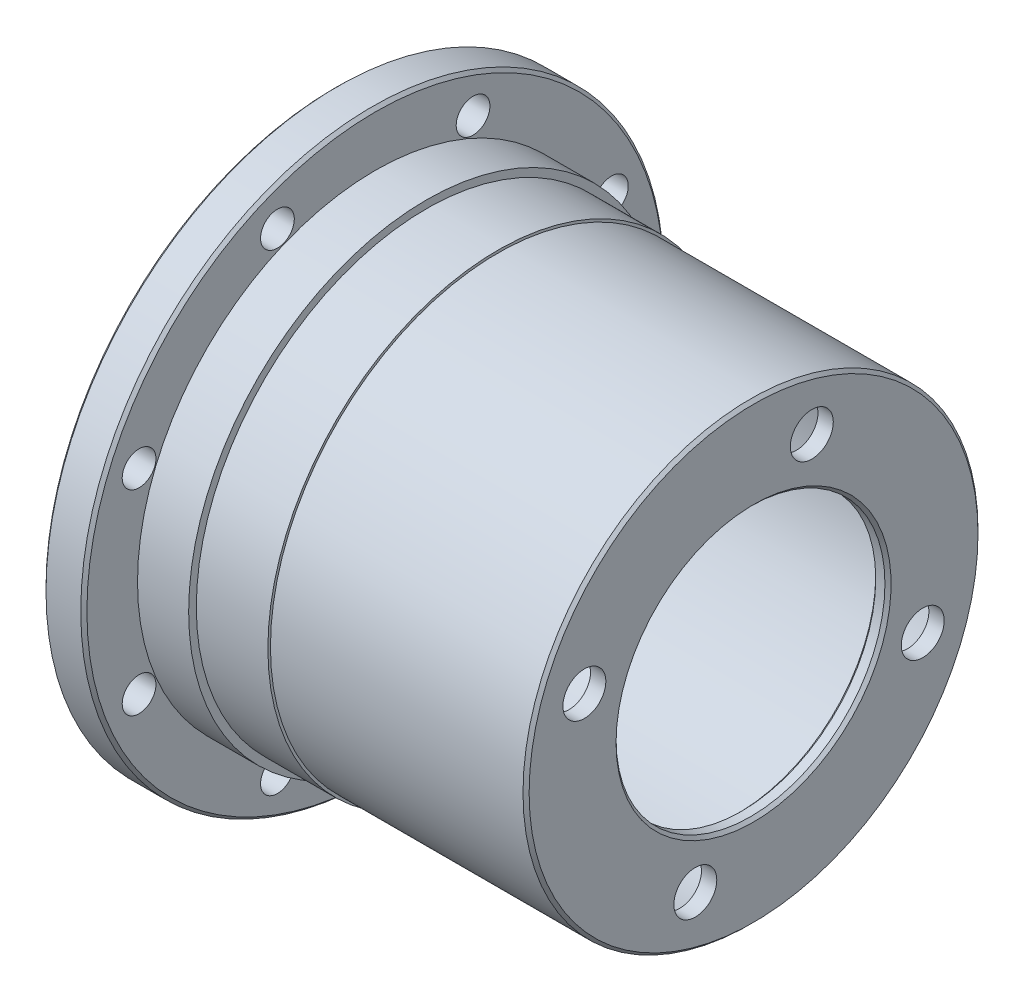
ISO-10303-21;
HEADER;
FILE_DESCRIPTION(('STEP AP214'),'2;1');
FILE_NAME('part.step','',(''),(''),'','','');
FILE_SCHEMA(('AUTOMOTIVE_DESIGN { 1 0 10303 214 1 1 1 1 }'));
ENDSEC;
DATA;
#1=APPLICATION_CONTEXT('core data for automotive mechanical design processes');
#2=APPLICATION_PROTOCOL_DEFINITION('international standard','automotive_design',2000,#1);
#3=PRODUCT_CONTEXT('',#1,'mechanical');
#4=PRODUCT('Part','Part','',(#3));
#5=PRODUCT_RELATED_PRODUCT_CATEGORY('part','',(#4));
#6=PRODUCT_DEFINITION_FORMATION('','',#4);
#7=PRODUCT_DEFINITION_CONTEXT('part definition',#1,'design');
#8=PRODUCT_DEFINITION('design','',#6,#7);
#9=PRODUCT_DEFINITION_SHAPE('','',#8);
#10=(LENGTH_UNIT() NAMED_UNIT(*) SI_UNIT(.MILLI.,.METRE.));
#11=(NAMED_UNIT(*) PLANE_ANGLE_UNIT() SI_UNIT($,.RADIAN.));
#12=(NAMED_UNIT(*) SI_UNIT($,.STERADIAN.) SOLID_ANGLE_UNIT());
#13=UNCERTAINTY_MEASURE_WITH_UNIT(LENGTH_MEASURE(1.E-05),#10,'distance_accuracy_value','');
#14=(GEOMETRIC_REPRESENTATION_CONTEXT(3) GLOBAL_UNCERTAINTY_ASSIGNED_CONTEXT((#13)) GLOBAL_UNIT_ASSIGNED_CONTEXT((#10,
#11,#12)) REPRESENTATION_CONTEXT('',''));
#15=CARTESIAN_POINT('',(0.,0.,0.));
#16=DIRECTION('',(0.,0.,1.));
#17=DIRECTION('',(1.,0.,0.));
#18=AXIS2_PLACEMENT_3D('',#15,#16,#17);
#19=CARTESIAN_POINT('',(0.,0.,0.));
#20=DIRECTION('',(-1.,0.,0.));
#21=DIRECTION('',(0.,0.,1.));
#22=AXIS2_PLACEMENT_3D('',#19,#20,#21);
#23=CYLINDRICAL_SURFACE('',#22,21.05);
#24=CARTESIAN_POINT('',(39.5,0.,0.));
#25=DIRECTION('',(-1.,0.,0.));
#26=DIRECTION('',(0.,0.,1.));
#27=AXIS2_PLACEMENT_3D('',#24,#25,#26);
#28=CIRCLE('',#27,21.05);
#29=CARTESIAN_POINT('',(39.5,0.,21.05));
#30=VERTEX_POINT('',#29);
#31=EDGE_CURVE('E74',#30,#30,#28,.T.);
#32=ORIENTED_EDGE('',*,*,#31,.F.);
#33=EDGE_LOOP('',(#32));
#34=FACE_BOUND('',#33,.T.);
#35=CARTESIAN_POINT('',(0.,0.,0.));
#36=DIRECTION('',(-1.,0.,0.));
#37=DIRECTION('',(0.,0.,1.));
#38=AXIS2_PLACEMENT_3D('',#35,#36,#37);
#39=CIRCLE('',#38,21.05);
#40=CARTESIAN_POINT('',(0.,0.,21.05));
#41=VERTEX_POINT('',#40);
#42=EDGE_CURVE('E191',#41,#41,#39,.T.);
#43=ORIENTED_EDGE('',*,*,#42,.T.);
#44=EDGE_LOOP('',(#43));
#45=FACE_BOUND('',#44,.T.);
#46=ADVANCED_FACE('F49',(#34,#45),#23,.F.);
#47=CARTESIAN_POINT('',(0.,28.5,0.));
#48=DIRECTION('',(1.,0.,0.));
#49=DIRECTION('',(0.,0.,-1.));
#50=AXIS2_PLACEMENT_3D('',#47,#48,#49);
#51=PLANE('',#50);
#52=CARTESIAN_POINT('',(0.,-23.0969883127824,9.56708580912678));
#53=DIRECTION('',(-1.,0.,0.));
#54=DIRECTION('',(0.,0.,1.));
#55=AXIS2_PLACEMENT_3D('',#52,#53,#54);
#56=CIRCLE('',#55,1.65);
#57=CARTESIAN_POINT('',(0.,-23.0969883127824,11.2170858091268));
#58=VERTEX_POINT('',#57);
#59=EDGE_CURVE('E123',#58,#58,#56,.T.);
#60=ORIENTED_EDGE('',*,*,#59,.F.);
#61=EDGE_LOOP('',(#60));
#62=FACE_BOUND('',#61,.T.);
#63=CARTESIAN_POINT('',(0.,-9.56708580912766,23.096988312782));
#64=DIRECTION('',(-1.,0.,0.));
#65=DIRECTION('',(0.,0.,1.));
#66=AXIS2_PLACEMENT_3D('',#63,#64,#65);
#67=CIRCLE('',#66,1.65);
#68=CARTESIAN_POINT('',(0.,-9.56708580912766,24.746988312782));
#69=VERTEX_POINT('',#68);
#70=EDGE_CURVE('E108',#69,#69,#67,.T.);
#71=ORIENTED_EDGE('',*,*,#70,.F.);
#72=EDGE_LOOP('',(#71));
#73=FACE_BOUND('',#72,.T.);
#74=CARTESIAN_POINT('',(0.,9.56708580912686,23.0969883127823));
#75=DIRECTION('',(-1.,0.,0.));
#76=DIRECTION('',(0.,0.,1.));
#77=AXIS2_PLACEMENT_3D('',#74,#75,#76);
#78=CIRCLE('',#77,1.65);
#79=CARTESIAN_POINT('',(0.,9.56708580912686,24.7469883127823));
#80=VERTEX_POINT('',#79);
#81=EDGE_CURVE('E104',#80,#80,#78,.T.);
#82=ORIENTED_EDGE('',*,*,#81,.F.);
#83=EDGE_LOOP('',(#82));
#84=FACE_BOUND('',#83,.T.);
#85=CARTESIAN_POINT('',(0.,23.0969883127821,9.56708580912742));
#86=DIRECTION('',(-1.,0.,0.));
#87=DIRECTION('',(0.,0.,1.));
#88=AXIS2_PLACEMENT_3D('',#85,#86,#87);
#89=CIRCLE('',#88,1.65);
#90=CARTESIAN_POINT('',(0.,23.0969883127821,11.2170858091274));
#91=VERTEX_POINT('',#90);
#92=EDGE_CURVE('E100',#91,#91,#89,.T.);
#93=ORIENTED_EDGE('',*,*,#92,.F.);
#94=EDGE_LOOP('',(#93));
#95=FACE_BOUND('',#94,.T.);
#96=CARTESIAN_POINT('',(0.,23.0969883127823,-9.56708580912694));
#97=DIRECTION('',(-1.,0.,0.));
#98=DIRECTION('',(0.,0.,1.));
#99=AXIS2_PLACEMENT_3D('',#96,#97,#98);
#100=CIRCLE('',#99,1.65);
#101=CARTESIAN_POINT('',(0.,23.0969883127823,-7.91708580912694));
#102=VERTEX_POINT('',#101);
#103=EDGE_CURVE('E99',#102,#102,#100,.T.);
#104=ORIENTED_EDGE('',*,*,#103,.F.);
#105=EDGE_LOOP('',(#104));
#106=FACE_BOUND('',#105,.T.);
#107=CARTESIAN_POINT('',(0.,9.5670858091275,-23.0969883127821));
#108=DIRECTION('',(-1.,0.,0.));
#109=DIRECTION('',(0.,0.,1.));
#110=AXIS2_PLACEMENT_3D('',#107,#108,#109);
#111=CIRCLE('',#110,1.65);
#112=CARTESIAN_POINT('',(0.,9.5670858091275,-21.4469883127821));
#113=VERTEX_POINT('',#112);
#114=EDGE_CURVE('E136',#113,#113,#111,.T.);
#115=ORIENTED_EDGE('',*,*,#114,.F.);
#116=EDGE_LOOP('',(#115));
#117=FACE_BOUND('',#116,.T.);
#118=CARTESIAN_POINT('',(0.,-9.56708580912703,-23.0969883127823));
#119=DIRECTION('',(-1.,0.,0.));
#120=DIRECTION('',(0.,0.,1.));
#121=AXIS2_PLACEMENT_3D('',#118,#119,#120);
#122=CIRCLE('',#121,1.65);
#123=CARTESIAN_POINT('',(0.,-9.56708580912703,-21.4469883127823));
#124=VERTEX_POINT('',#123);
#125=EDGE_CURVE('E94',#124,#124,#122,.T.);
#126=ORIENTED_EDGE('',*,*,#125,.F.);
#127=EDGE_LOOP('',(#126));
#128=FACE_BOUND('',#127,.T.);
#129=CARTESIAN_POINT('',(0.,-23.0969883127821,-9.56708580912742));
#130=DIRECTION('',(-1.,0.,0.));
#131=DIRECTION('',(0.,0.,1.));
#132=AXIS2_PLACEMENT_3D('',#129,#130,#131);
#133=CIRCLE('',#132,1.65);
#134=CARTESIAN_POINT('',(0.,-23.0969883127821,-7.91708580912742));
#135=VERTEX_POINT('',#134);
#136=EDGE_CURVE('E93',#135,#135,#133,.T.);
#137=ORIENTED_EDGE('',*,*,#136,.F.);
#138=EDGE_LOOP('',(#137));
#139=FACE_BOUND('',#138,.T.);
#140=CARTESIAN_POINT('',(0.,0.,0.));
#141=DIRECTION('',(1.,0.,0.));
#142=DIRECTION('',(0.,0.,-1.));
#143=AXIS2_PLACEMENT_3D('',#140,#141,#142);
#144=CIRCLE('',#143,28.2);
#145=CARTESIAN_POINT('',(0.,0.,-28.2));
#146=VERTEX_POINT('',#145);
#147=EDGE_CURVE('E59',#146,#146,#144,.F.);
#148=ORIENTED_EDGE('',*,*,#147,.T.);
#149=EDGE_LOOP('',(#148));
#150=FACE_BOUND('',#149,.T.);
#151=ORIENTED_EDGE('',*,*,#42,.F.);
#152=EDGE_LOOP('',(#151));
#153=FACE_BOUND('',#152,.T.);
#154=ADVANCED_FACE('F241',(#62,#73,#84,#95,#106,#117,#128,#139,#150,#153),#51,.F.);
#155=CARTESIAN_POINT('',(0.,0.,0.));
#156=DIRECTION('',(-1.,0.,0.));
#157=DIRECTION('',(0.,0.,1.));
#158=AXIS2_PLACEMENT_3D('',#155,#156,#157);
#159=CYLINDRICAL_SURFACE('',#158,28.5);
#160=CARTESIAN_POINT('',(3.7,0.,0.));
#161=DIRECTION('',(-1.,0.,0.));
#162=DIRECTION('',(0.,0.,1.));
#163=AXIS2_PLACEMENT_3D('',#160,#161,#162);
#164=CIRCLE('',#163,28.5);
#165=CARTESIAN_POINT('',(3.7,0.,28.5));
#166=VERTEX_POINT('',#165);
#167=EDGE_CURVE('E219',#166,#166,#164,.T.);
#168=ORIENTED_EDGE('',*,*,#167,.T.);
#169=EDGE_LOOP('',(#168));
#170=FACE_BOUND('',#169,.T.);
#171=CARTESIAN_POINT('',(0.30000000000002,0.,0.));
#172=DIRECTION('',(1.,0.,0.));
#173=DIRECTION('',(0.,0.,-1.));
#174=AXIS2_PLACEMENT_3D('',#171,#172,#173);
#175=CIRCLE('',#174,28.5);
#176=CARTESIAN_POINT('',(0.30000000000002,0.,-28.5));
#177=VERTEX_POINT('',#176);
#178=EDGE_CURVE('E215',#177,#177,#175,.T.);
#179=ORIENTED_EDGE('',*,*,#178,.T.);
#180=EDGE_LOOP('',(#179));
#181=FACE_BOUND('',#180,.T.);
#182=ADVANCED_FACE('F238',(#170,#181),#159,.T.);
#183=CARTESIAN_POINT('',(4.,23.25,0.));
#184=DIRECTION('',(-1.,0.,0.));
#185=DIRECTION('',(0.,0.,1.));
#186=AXIS2_PLACEMENT_3D('',#183,#184,#185);
#187=PLANE('',#186);
#188=CARTESIAN_POINT('',(4.,-23.0969883127824,9.56708580912678));
#189=DIRECTION('',(-1.,0.,0.));
#190=DIRECTION('',(0.,0.,1.));
#191=AXIS2_PLACEMENT_3D('',#188,#189,#190);
#192=CIRCLE('',#191,1.65);
#193=CARTESIAN_POINT('',(4.,-23.0969883127824,11.2170858091268));
#194=VERTEX_POINT('',#193);
#195=EDGE_CURVE('E54',#194,#194,#192,.T.);
#196=ORIENTED_EDGE('',*,*,#195,.T.);
#197=EDGE_LOOP('',(#196));
#198=FACE_BOUND('',#197,.T.);
#199=CARTESIAN_POINT('',(4.,-9.56708580912766,23.096988312782));
#200=DIRECTION('',(-1.,0.,0.));
#201=DIRECTION('',(0.,0.,1.));
#202=AXIS2_PLACEMENT_3D('',#199,#200,#201);
#203=CIRCLE('',#202,1.65);
#204=CARTESIAN_POINT('',(4.,-9.56708580912766,24.746988312782));
#205=VERTEX_POINT('',#204);
#206=EDGE_CURVE('E105',#205,#205,#203,.T.);
#207=ORIENTED_EDGE('',*,*,#206,.T.);
#208=EDGE_LOOP('',(#207));
#209=FACE_BOUND('',#208,.T.);
#210=CARTESIAN_POINT('',(4.,9.56708580912686,23.0969883127823));
#211=DIRECTION('',(-1.,0.,0.));
#212=DIRECTION('',(0.,0.,1.));
#213=AXIS2_PLACEMENT_3D('',#210,#211,#212);
#214=CIRCLE('',#213,1.65);
#215=CARTESIAN_POINT('',(4.,9.56708580912686,24.7469883127823));
#216=VERTEX_POINT('',#215);
#217=EDGE_CURVE('E101',#216,#216,#214,.T.);
#218=ORIENTED_EDGE('',*,*,#217,.T.);
#219=EDGE_LOOP('',(#218));
#220=FACE_BOUND('',#219,.T.);
#221=CARTESIAN_POINT('',(4.,23.0969883127821,9.56708580912742));
#222=DIRECTION('',(-1.,0.,0.));
#223=DIRECTION('',(0.,0.,1.));
#224=AXIS2_PLACEMENT_3D('',#221,#222,#223);
#225=CIRCLE('',#224,1.65);
#226=CARTESIAN_POINT('',(4.,23.0969883127821,11.2170858091274));
#227=VERTEX_POINT('',#226);
#228=EDGE_CURVE('E95',#227,#227,#225,.T.);
#229=ORIENTED_EDGE('',*,*,#228,.T.);
#230=EDGE_LOOP('',(#229));
#231=FACE_BOUND('',#230,.T.);
#232=CARTESIAN_POINT('',(4.,23.0969883127823,-9.56708580912694));
#233=DIRECTION('',(-1.,0.,0.));
#234=DIRECTION('',(0.,0.,1.));
#235=AXIS2_PLACEMENT_3D('',#232,#233,#234);
#236=CIRCLE('',#235,1.65);
#237=CARTESIAN_POINT('',(4.,23.0969883127823,-7.91708580912695));
#238=VERTEX_POINT('',#237);
#239=EDGE_CURVE('E132',#238,#238,#236,.T.);
#240=ORIENTED_EDGE('',*,*,#239,.T.);
#241=EDGE_LOOP('',(#240));
#242=FACE_BOUND('',#241,.T.);
#243=CARTESIAN_POINT('',(4.,9.5670858091275,-23.0969883127821));
#244=DIRECTION('',(-1.,0.,0.));
#245=DIRECTION('',(0.,0.,1.));
#246=AXIS2_PLACEMENT_3D('',#243,#244,#245);
#247=CIRCLE('',#246,1.65);
#248=CARTESIAN_POINT('',(4.,9.5670858091275,-21.4469883127821));
#249=VERTEX_POINT('',#248);
#250=EDGE_CURVE('E140',#249,#249,#247,.T.);
#251=ORIENTED_EDGE('',*,*,#250,.T.);
#252=EDGE_LOOP('',(#251));
#253=FACE_BOUND('',#252,.T.);
#254=CARTESIAN_POINT('',(4.,-9.56708580912703,-23.0969883127823));
#255=DIRECTION('',(-1.,0.,0.));
#256=DIRECTION('',(0.,0.,1.));
#257=AXIS2_PLACEMENT_3D('',#254,#255,#256);
#258=CIRCLE('',#257,1.65);
#259=CARTESIAN_POINT('',(4.,-9.56708580912703,-21.4469883127823));
#260=VERTEX_POINT('',#259);
#261=EDGE_CURVE('E89',#260,#260,#258,.T.);
#262=ORIENTED_EDGE('',*,*,#261,.T.);
#263=EDGE_LOOP('',(#262));
#264=FACE_BOUND('',#263,.T.);
#265=CARTESIAN_POINT('',(4.,-23.0969883127821,-9.56708580912742));
#266=DIRECTION('',(-1.,0.,0.));
#267=DIRECTION('',(0.,0.,1.));
#268=AXIS2_PLACEMENT_3D('',#265,#266,#267);
#269=CIRCLE('',#268,1.65);
#270=CARTESIAN_POINT('',(4.,-23.0969883127821,-7.91708580912742));
#271=VERTEX_POINT('',#270);
#272=EDGE_CURVE('E150',#271,#271,#269,.T.);
#273=ORIENTED_EDGE('',*,*,#272,.T.);
#274=EDGE_LOOP('',(#273));
#275=FACE_BOUND('',#274,.T.);
#276=CARTESIAN_POINT('',(4.,0.,0.));
#277=DIRECTION('',(-1.,0.,0.));
#278=DIRECTION('',(0.,0.,1.));
#279=AXIS2_PLACEMENT_3D('',#276,#277,#278);
#280=CIRCLE('',#279,28.2);
#281=CARTESIAN_POINT('',(4.,0.,28.2));
#282=VERTEX_POINT('',#281);
#283=EDGE_CURVE('E66',#282,#282,#280,.F.);
#284=ORIENTED_EDGE('',*,*,#283,.T.);
#285=EDGE_LOOP('',(#284));
#286=FACE_BOUND('',#285,.T.);
#287=CARTESIAN_POINT('',(4.,0.,0.));
#288=DIRECTION('',(-1.,0.,0.));
#289=DIRECTION('',(0.,0.,1.));
#290=AXIS2_PLACEMENT_3D('',#287,#288,#289);
#291=CIRCLE('',#290,23.25);
#292=CARTESIAN_POINT('',(4.,0.,23.25));
#293=VERTEX_POINT('',#292);
#294=EDGE_CURVE('E187',#293,#293,#291,.T.);
#295=ORIENTED_EDGE('',*,*,#294,.T.);
#296=EDGE_LOOP('',(#295));
#297=FACE_BOUND('',#296,.T.);
#298=ADVANCED_FACE('F227',(#198,#209,#220,#231,#242,#253,#264,#275,#286,#297),#187,.F.);
#299=CARTESIAN_POINT('',(0.,0.,0.));
#300=DIRECTION('',(-1.,0.,0.));
#301=DIRECTION('',(0.,0.,1.));
#302=AXIS2_PLACEMENT_3D('',#299,#300,#301);
#303=CYLINDRICAL_SURFACE('',#302,23.25);
#304=ORIENTED_EDGE('',*,*,#294,.F.);
#305=EDGE_LOOP('',(#304));
#306=FACE_BOUND('',#305,.T.);
#307=CARTESIAN_POINT('',(9.,0.,0.));
#308=DIRECTION('',(-1.,0.,0.));
#309=DIRECTION('',(0.,0.,1.));
#310=AXIS2_PLACEMENT_3D('',#307,#308,#309);
#311=CIRCLE('',#310,23.25);
#312=CARTESIAN_POINT('',(9.,0.,23.25));
#313=VERTEX_POINT('',#312);
#314=EDGE_CURVE('E183',#313,#313,#311,.T.);
#315=ORIENTED_EDGE('',*,*,#314,.T.);
#316=EDGE_LOOP('',(#315));
#317=FACE_BOUND('',#316,.T.);
#318=ADVANCED_FACE('F336',(#306,#317),#303,.T.);
#319=CARTESIAN_POINT('',(9.,22.5,0.));
#320=DIRECTION('',(-1.,0.,0.));
#321=DIRECTION('',(0.,0.,1.));
#322=AXIS2_PLACEMENT_3D('',#319,#320,#321);
#323=PLANE('',#322);
#324=ORIENTED_EDGE('',*,*,#314,.F.);
#325=EDGE_LOOP('',(#324));
#326=FACE_BOUND('',#325,.T.);
#327=CARTESIAN_POINT('',(9.,0.,0.));
#328=DIRECTION('',(-1.,0.,0.));
#329=DIRECTION('',(0.,0.,1.));
#330=AXIS2_PLACEMENT_3D('',#327,#328,#329);
#331=CIRCLE('',#330,22.5);
#332=CARTESIAN_POINT('',(9.,0.,22.5));
#333=VERTEX_POINT('',#332);
#334=EDGE_CURVE('E179',#333,#333,#331,.T.);
#335=ORIENTED_EDGE('',*,*,#334,.T.);
#336=EDGE_LOOP('',(#335));
#337=FACE_BOUND('',#336,.T.);
#338=ADVANCED_FACE('F332',(#326,#337),#323,.F.);
#339=CARTESIAN_POINT('',(0.,0.,0.));
#340=DIRECTION('',(-1.,0.,0.));
#341=DIRECTION('',(0.,0.,1.));
#342=AXIS2_PLACEMENT_3D('',#339,#340,#341);
#343=CYLINDRICAL_SURFACE('',#342,22.5);
#344=ORIENTED_EDGE('',*,*,#334,.F.);
#345=EDGE_LOOP('',(#344));
#346=FACE_BOUND('',#345,.T.);
#347=CARTESIAN_POINT('',(16.,0.,0.));
#348=DIRECTION('',(-1.,0.,0.));
#349=DIRECTION('',(0.,0.,1.));
#350=AXIS2_PLACEMENT_3D('',#347,#348,#349);
#351=CIRCLE('',#350,22.5);
#352=CARTESIAN_POINT('',(16.,0.,22.5));
#353=VERTEX_POINT('',#352);
#354=EDGE_CURVE('E175',#353,#353,#351,.T.);
#355=ORIENTED_EDGE('',*,*,#354,.T.);
#356=EDGE_LOOP('',(#355));
#357=FACE_BOUND('',#356,.T.);
#358=ADVANCED_FACE('F328',(#346,#357),#343,.T.);
#359=CARTESIAN_POINT('',(16.,22.25,0.));
#360=DIRECTION('',(-1.,0.,0.));
#361=DIRECTION('',(0.,0.,1.));
#362=AXIS2_PLACEMENT_3D('',#359,#360,#361);
#363=PLANE('',#362);
#364=ORIENTED_EDGE('',*,*,#354,.F.);
#365=EDGE_LOOP('',(#364));
#366=FACE_BOUND('',#365,.T.);
#367=CARTESIAN_POINT('',(16.,0.,0.));
#368=DIRECTION('',(-1.,0.,0.));
#369=DIRECTION('',(0.,0.,1.));
#370=AXIS2_PLACEMENT_3D('',#367,#368,#369);
#371=CIRCLE('',#370,22.25);
#372=CARTESIAN_POINT('',(16.,0.,22.25));
#373=VERTEX_POINT('',#372);
#374=EDGE_CURVE('E171',#373,#373,#371,.T.);
#375=ORIENTED_EDGE('',*,*,#374,.T.);
#376=EDGE_LOOP('',(#375));
#377=FACE_BOUND('',#376,.T.);
#378=ADVANCED_FACE('F325',(#366,#377),#363,.F.);
#379=CARTESIAN_POINT('',(0.,0.,0.));
#380=DIRECTION('',(-1.,0.,0.));
#381=DIRECTION('',(0.,0.,1.));
#382=AXIS2_PLACEMENT_3D('',#379,#380,#381);
#383=CYLINDRICAL_SURFACE('',#382,22.25);
#384=CARTESIAN_POINT('',(40.7,0.,0.));
#385=DIRECTION('',(-1.,0.,0.));
#386=DIRECTION('',(0.,0.,1.));
#387=AXIS2_PLACEMENT_3D('',#384,#385,#386);
#388=CIRCLE('',#387,22.25);
#389=CARTESIAN_POINT('',(40.7,0.,22.25));
#390=VERTEX_POINT('',#389);
#391=EDGE_CURVE('E10',#390,#390,#388,.T.);
#392=ORIENTED_EDGE('',*,*,#391,.T.);
#393=EDGE_LOOP('',(#392));
#394=FACE_BOUND('',#393,.T.);
#395=ORIENTED_EDGE('',*,*,#374,.F.);
#396=EDGE_LOOP('',(#395));
#397=FACE_BOUND('',#396,.T.);
#398=ADVANCED_FACE('F294',(#394,#397),#383,.T.);
#399=CARTESIAN_POINT('',(41.,13.15,0.));
#400=DIRECTION('',(-1.,0.,0.));
#401=DIRECTION('',(0.,0.,1.));
#402=AXIS2_PLACEMENT_3D('',#399,#400,#401);
#403=PLANE('',#402);
#404=CARTESIAN_POINT('',(41.,-5.69744270300031,-16.546575072988));
#405=DIRECTION('',(1.,0.,0.));
#406=DIRECTION('',(0.,-1.,0.));
#407=AXIS2_PLACEMENT_3D('',#404,#405,#406);
#408=CIRCLE('',#407,2.1);
#409=CARTESIAN_POINT('',(41.,-7.79744270300031,-16.546575072988));
#410=VERTEX_POINT('',#409);
#411=EDGE_CURVE('E81',#410,#410,#408,.T.);
#412=ORIENTED_EDGE('',*,*,#411,.F.);
#413=EDGE_LOOP('',(#412));
#414=FACE_BOUND('',#413,.T.);
#415=CARTESIAN_POINT('',(41.,-16.546575072988,5.69744270300025));
#416=DIRECTION('',(1.,0.,0.));
#417=DIRECTION('',(0.,0.,1.));
#418=AXIS2_PLACEMENT_3D('',#415,#416,#417);
#419=CIRCLE('',#418,2.1);
#420=CARTESIAN_POINT('',(41.,-16.546575072988,7.79744270300025));
#421=VERTEX_POINT('',#420);
#422=EDGE_CURVE('E158',#421,#421,#419,.T.);
#423=ORIENTED_EDGE('',*,*,#422,.F.);
#424=EDGE_LOOP('',(#423));
#425=FACE_BOUND('',#424,.T.);
#426=CARTESIAN_POINT('',(41.,5.69744270300043,16.546575072988));
#427=DIRECTION('',(1.,0.,0.));
#428=DIRECTION('',(0.,1.,0.));
#429=AXIS2_PLACEMENT_3D('',#426,#427,#428);
#430=CIRCLE('',#429,2.1);
#431=CARTESIAN_POINT('',(41.,7.79744270300043,16.546575072988));
#432=VERTEX_POINT('',#431);
#433=EDGE_CURVE('E154',#432,#432,#430,.T.);
#434=ORIENTED_EDGE('',*,*,#433,.F.);
#435=EDGE_LOOP('',(#434));
#436=FACE_BOUND('',#435,.T.);
#437=CARTESIAN_POINT('',(41.,16.546575072988,-5.69744270300025));
#438=DIRECTION('',(1.,0.,0.));
#439=DIRECTION('',(0.,0.,-1.));
#440=AXIS2_PLACEMENT_3D('',#437,#438,#439);
#441=CIRCLE('',#440,2.1);
#442=CARTESIAN_POINT('',(41.,16.546575072988,-7.79744270300025));
#443=VERTEX_POINT('',#442);
#444=EDGE_CURVE('E75',#443,#443,#441,.T.);
#445=ORIENTED_EDGE('',*,*,#444,.F.);
#446=EDGE_LOOP('',(#445));
#447=FACE_BOUND('',#446,.T.);
#448=CARTESIAN_POINT('',(41.,0.,0.));
#449=DIRECTION('',(-1.,0.,0.));
#450=DIRECTION('',(0.,0.,1.));
#451=AXIS2_PLACEMENT_3D('',#448,#449,#450);
#452=CIRCLE('',#451,13.45);
#453=CARTESIAN_POINT('',(41.,0.,13.45));
#454=VERTEX_POINT('',#453);
#455=EDGE_CURVE('E211',#454,#454,#452,.T.);
#456=ORIENTED_EDGE('',*,*,#455,.T.);
#457=EDGE_LOOP('',(#456));
#458=FACE_BOUND('',#457,.T.);
#459=CARTESIAN_POINT('',(41.,0.,0.));
#460=DIRECTION('',(-1.,0.,0.));
#461=DIRECTION('',(0.,0.,1.));
#462=AXIS2_PLACEMENT_3D('',#459,#460,#461);
#463=CIRCLE('',#462,21.95);
#464=CARTESIAN_POINT('',(41.,0.,21.95));
#465=VERTEX_POINT('',#464);
#466=EDGE_CURVE('E207',#465,#465,#463,.F.);
#467=ORIENTED_EDGE('',*,*,#466,.T.);
#468=EDGE_LOOP('',(#467));
#469=FACE_BOUND('',#468,.T.);
#470=ADVANCED_FACE('F290',(#414,#425,#436,#447,#458,#469),#403,.F.);
#471=CARTESIAN_POINT('',(0.,0.,0.));
#472=DIRECTION('',(-1.,0.,0.));
#473=DIRECTION('',(0.,0.,1.));
#474=AXIS2_PLACEMENT_3D('',#471,#472,#473);
#475=CYLINDRICAL_SURFACE('',#474,13.15);
#476=CARTESIAN_POINT('',(39.8,0.,0.));
#477=DIRECTION('',(1.,0.,0.));
#478=DIRECTION('',(0.,0.,-1.));
#479=AXIS2_PLACEMENT_3D('',#476,#477,#478);
#480=CIRCLE('',#479,13.15);
#481=CARTESIAN_POINT('',(39.8,0.,-13.15));
#482=VERTEX_POINT('',#481);
#483=EDGE_CURVE('E199',#482,#482,#480,.F.);
#484=ORIENTED_EDGE('',*,*,#483,.T.);
#485=EDGE_LOOP('',(#484));
#486=FACE_BOUND('',#485,.T.);
#487=CARTESIAN_POINT('',(40.7,0.,0.));
#488=DIRECTION('',(-1.,0.,0.));
#489=DIRECTION('',(0.,0.,1.));
#490=AXIS2_PLACEMENT_3D('',#487,#488,#489);
#491=CIRCLE('',#490,13.15);
#492=CARTESIAN_POINT('',(40.7,0.,13.15));
#493=VERTEX_POINT('',#492);
#494=EDGE_CURVE('E195',#493,#493,#491,.F.);
#495=ORIENTED_EDGE('',*,*,#494,.T.);
#496=EDGE_LOOP('',(#495));
#497=FACE_BOUND('',#496,.T.);
#498=ADVANCED_FACE('F293',(#486,#497),#475,.F.);
#499=CARTESIAN_POINT('',(39.5,21.05,0.));
#500=DIRECTION('',(1.,0.,0.));
#501=DIRECTION('',(0.,0.,-1.));
#502=AXIS2_PLACEMENT_3D('',#499,#500,#501);
#503=PLANE('',#502);
#504=CARTESIAN_POINT('',(39.5,-5.69744270300031,-16.546575072988));
#505=DIRECTION('',(1.,0.,0.));
#506=DIRECTION('',(0.,0.,-1.));
#507=AXIS2_PLACEMENT_3D('',#504,#505,#506);
#508=CIRCLE('',#507,2.1);
#509=CARTESIAN_POINT('',(39.5,-5.69744270300031,-18.646575072988));
#510=VERTEX_POINT('',#509);
#511=EDGE_CURVE('E85',#510,#510,#508,.T.);
#512=ORIENTED_EDGE('',*,*,#511,.T.);
#513=EDGE_LOOP('',(#512));
#514=FACE_BOUND('',#513,.T.);
#515=CARTESIAN_POINT('',(39.5,-16.546575072988,5.69744270300025));
#516=DIRECTION('',(1.,0.,0.));
#517=DIRECTION('',(0.,0.,-1.));
#518=AXIS2_PLACEMENT_3D('',#515,#516,#517);
#519=CIRCLE('',#518,2.1);
#520=CARTESIAN_POINT('',(39.5,-16.546575072988,3.59744270300025));
#521=VERTEX_POINT('',#520);
#522=EDGE_CURVE('E80',#521,#521,#519,.T.);
#523=ORIENTED_EDGE('',*,*,#522,.T.);
#524=EDGE_LOOP('',(#523));
#525=FACE_BOUND('',#524,.T.);
#526=CARTESIAN_POINT('',(39.5,5.69744270300043,16.546575072988));
#527=DIRECTION('',(1.,0.,0.));
#528=DIRECTION('',(0.,0.,-1.));
#529=AXIS2_PLACEMENT_3D('',#526,#527,#528);
#530=CIRCLE('',#529,2.1);
#531=CARTESIAN_POINT('',(39.5,5.69744270300043,14.446575072988));
#532=VERTEX_POINT('',#531);
#533=EDGE_CURVE('E76',#532,#532,#530,.T.);
#534=ORIENTED_EDGE('',*,*,#533,.T.);
#535=EDGE_LOOP('',(#534));
#536=FACE_BOUND('',#535,.T.);
#537=CARTESIAN_POINT('',(39.5,16.546575072988,-5.69744270300025));
#538=DIRECTION('',(1.,0.,0.));
#539=DIRECTION('',(0.,0.,-1.));
#540=AXIS2_PLACEMENT_3D('',#537,#538,#539);
#541=CIRCLE('',#540,2.1);
#542=CARTESIAN_POINT('',(39.5,16.546575072988,-7.79744270300025));
#543=VERTEX_POINT('',#542);
#544=EDGE_CURVE('E70',#543,#543,#541,.T.);
#545=ORIENTED_EDGE('',*,*,#544,.T.);
#546=EDGE_LOOP('',(#545));
#547=FACE_BOUND('',#546,.T.);
#548=CARTESIAN_POINT('',(39.5,0.,0.));
#549=DIRECTION('',(1.,0.,0.));
#550=DIRECTION('',(0.,0.,-1.));
#551=AXIS2_PLACEMENT_3D('',#548,#549,#550);
#552=CIRCLE('',#551,13.45);
#553=CARTESIAN_POINT('',(39.5,0.,-13.45));
#554=VERTEX_POINT('',#553);
#555=EDGE_CURVE('E203',#554,#554,#552,.T.);
#556=ORIENTED_EDGE('',*,*,#555,.T.);
#557=EDGE_LOOP('',(#556));
#558=FACE_BOUND('',#557,.T.);
#559=ORIENTED_EDGE('',*,*,#31,.T.);
#560=EDGE_LOOP('',(#559));
#561=FACE_BOUND('',#560,.T.);
#562=ADVANCED_FACE('F270',(#514,#525,#536,#547,#558,#561),#503,.F.);
#563=CARTESIAN_POINT('',(39.8,0.,0.));
#564=DIRECTION('',(-1.,0.,0.));
#565=DIRECTION('',(0.,0.,1.));
#566=AXIS2_PLACEMENT_3D('',#563,#564,#565);
#567=CONICAL_SURFACE('',#566,13.15,0.785398163397445);
#568=ORIENTED_EDGE('',*,*,#555,.F.);
#569=EDGE_LOOP('',(#568));
#570=FACE_BOUND('',#569,.T.);
#571=ORIENTED_EDGE('',*,*,#483,.F.);
#572=EDGE_LOOP('',(#571));
#573=FACE_BOUND('',#572,.T.);
#574=ADVANCED_FACE('F264',(#570,#573),#567,.F.);
#575=CARTESIAN_POINT('',(41.,0.,0.));
#576=DIRECTION('',(1.,0.,0.));
#577=DIRECTION('',(0.,0.,-1.));
#578=AXIS2_PLACEMENT_3D('',#575,#576,#577);
#579=CONICAL_SURFACE('',#578,13.45,0.785398163397443);
#580=ORIENTED_EDGE('',*,*,#494,.F.);
#581=EDGE_LOOP('',(#580));
#582=FACE_BOUND('',#581,.T.);
#583=ORIENTED_EDGE('',*,*,#455,.F.);
#584=EDGE_LOOP('',(#583));
#585=FACE_BOUND('',#584,.T.);
#586=ADVANCED_FACE('F234',(#582,#585),#579,.F.);
#587=CARTESIAN_POINT('',(3.7,0.,0.));
#588=DIRECTION('',(-1.,0.,0.));
#589=DIRECTION('',(0.,0.,1.));
#590=AXIS2_PLACEMENT_3D('',#587,#588,#589);
#591=CONICAL_SURFACE('',#590,28.5,0.785398163397443);
#592=ORIENTED_EDGE('',*,*,#283,.F.);
#593=EDGE_LOOP('',(#592));
#594=FACE_BOUND('',#593,.T.);
#595=ORIENTED_EDGE('',*,*,#167,.F.);
#596=EDGE_LOOP('',(#595));
#597=FACE_BOUND('',#596,.T.);
#598=ADVANCED_FACE('F230',(#594,#597),#591,.T.);
#599=CARTESIAN_POINT('',(0.,0.,0.));
#600=DIRECTION('',(1.,0.,0.));
#601=DIRECTION('',(0.,0.,-1.));
#602=AXIS2_PLACEMENT_3D('',#599,#600,#601);
#603=CONICAL_SURFACE('',#602,28.2,0.785398163397443);
#604=ORIENTED_EDGE('',*,*,#178,.F.);
#605=EDGE_LOOP('',(#604));
#606=FACE_BOUND('',#605,.T.);
#607=ORIENTED_EDGE('',*,*,#147,.F.);
#608=EDGE_LOOP('',(#607));
#609=FACE_BOUND('',#608,.T.);
#610=ADVANCED_FACE('F233',(#606,#609),#603,.T.);
#611=CARTESIAN_POINT('',(40.7,0.,0.));
#612=DIRECTION('',(-1.,0.,0.));
#613=DIRECTION('',(0.,0.,1.));
#614=AXIS2_PLACEMENT_3D('',#611,#612,#613);
#615=CONICAL_SURFACE('',#614,22.25,0.785398163397448);
#616=ORIENTED_EDGE('',*,*,#466,.F.);
#617=EDGE_LOOP('',(#616));
#618=FACE_BOUND('',#617,.T.);
#619=ORIENTED_EDGE('',*,*,#391,.F.);
#620=EDGE_LOOP('',(#619));
#621=FACE_BOUND('',#620,.T.);
#622=ADVANCED_FACE('F52',(#618,#621),#615,.T.);
#623=CARTESIAN_POINT('',(0.,16.546575072988,-5.69744270300025));
#624=DIRECTION('',(1.,0.,0.));
#625=DIRECTION('',(0.,0.,-1.));
#626=AXIS2_PLACEMENT_3D('',#623,#624,#625);
#627=CYLINDRICAL_SURFACE('',#626,2.1);
#628=ORIENTED_EDGE('',*,*,#444,.T.);
#629=EDGE_LOOP('',(#628));
#630=FACE_BOUND('',#629,.T.);
#631=ORIENTED_EDGE('',*,*,#544,.F.);
#632=EDGE_LOOP('',(#631));
#633=FACE_BOUND('',#632,.T.);
#634=ADVANCED_FACE('F301',(#630,#633),#627,.F.);
#635=CARTESIAN_POINT('',(0.,5.69744270300043,16.546575072988));
#636=DIRECTION('',(1.,0.,0.));
#637=DIRECTION('',(0.,0.,-1.));
#638=AXIS2_PLACEMENT_3D('',#635,#636,#637);
#639=CYLINDRICAL_SURFACE('',#638,2.1);
#640=ORIENTED_EDGE('',*,*,#433,.T.);
#641=EDGE_LOOP('',(#640));
#642=FACE_BOUND('',#641,.T.);
#643=ORIENTED_EDGE('',*,*,#533,.F.);
#644=EDGE_LOOP('',(#643));
#645=FACE_BOUND('',#644,.T.);
#646=ADVANCED_FACE('F305',(#642,#645),#639,.F.);
#647=CARTESIAN_POINT('',(0.,-16.546575072988,5.69744270300025));
#648=DIRECTION('',(1.,0.,0.));
#649=DIRECTION('',(0.,0.,-1.));
#650=AXIS2_PLACEMENT_3D('',#647,#648,#649);
#651=CYLINDRICAL_SURFACE('',#650,2.1);
#652=ORIENTED_EDGE('',*,*,#422,.T.);
#653=EDGE_LOOP('',(#652));
#654=FACE_BOUND('',#653,.T.);
#655=ORIENTED_EDGE('',*,*,#522,.F.);
#656=EDGE_LOOP('',(#655));
#657=FACE_BOUND('',#656,.T.);
#658=ADVANCED_FACE('F311',(#654,#657),#651,.F.);
#659=CARTESIAN_POINT('',(0.,-5.69744270300031,-16.546575072988));
#660=DIRECTION('',(1.,0.,0.));
#661=DIRECTION('',(0.,0.,-1.));
#662=AXIS2_PLACEMENT_3D('',#659,#660,#661);
#663=CYLINDRICAL_SURFACE('',#662,2.1);
#664=ORIENTED_EDGE('',*,*,#411,.T.);
#665=EDGE_LOOP('',(#664));
#666=FACE_BOUND('',#665,.T.);
#667=ORIENTED_EDGE('',*,*,#511,.F.);
#668=EDGE_LOOP('',(#667));
#669=FACE_BOUND('',#668,.T.);
#670=ADVANCED_FACE('F362',(#666,#669),#663,.F.);
#671=CARTESIAN_POINT('',(0.,-23.0969883127821,-9.56708580912742));
#672=DIRECTION('',(-1.,0.,0.));
#673=DIRECTION('',(0.,0.,1.));
#674=AXIS2_PLACEMENT_3D('',#671,#672,#673);
#675=CYLINDRICAL_SURFACE('',#674,1.65);
#676=ORIENTED_EDGE('',*,*,#136,.T.);
#677=EDGE_LOOP('',(#676));
#678=FACE_BOUND('',#677,.T.);
#679=ORIENTED_EDGE('',*,*,#272,.F.);
#680=EDGE_LOOP('',(#679));
#681=FACE_BOUND('',#680,.T.);
#682=ADVANCED_FACE('F359',(#678,#681),#675,.F.);
#683=CARTESIAN_POINT('',(0.,-9.56708580912703,-23.0969883127823));
#684=DIRECTION('',(-1.,0.,0.));
#685=DIRECTION('',(0.,0.,1.));
#686=AXIS2_PLACEMENT_3D('',#683,#684,#685);
#687=CYLINDRICAL_SURFACE('',#686,1.65);
#688=ORIENTED_EDGE('',*,*,#125,.T.);
#689=EDGE_LOOP('',(#688));
#690=FACE_BOUND('',#689,.T.);
#691=ORIENTED_EDGE('',*,*,#261,.F.);
#692=EDGE_LOOP('',(#691));
#693=FACE_BOUND('',#692,.T.);
#694=ADVANCED_FACE('F361',(#690,#693),#687,.F.);
#695=CARTESIAN_POINT('',(0.,9.5670858091275,-23.0969883127821));
#696=DIRECTION('',(-1.,0.,0.));
#697=DIRECTION('',(0.,0.,1.));
#698=AXIS2_PLACEMENT_3D('',#695,#696,#697);
#699=CYLINDRICAL_SURFACE('',#698,1.65);
#700=ORIENTED_EDGE('',*,*,#114,.T.);
#701=EDGE_LOOP('',(#700));
#702=FACE_BOUND('',#701,.T.);
#703=ORIENTED_EDGE('',*,*,#250,.F.);
#704=EDGE_LOOP('',(#703));
#705=FACE_BOUND('',#704,.T.);
#706=ADVANCED_FACE('F368',(#702,#705),#699,.F.);
#707=CARTESIAN_POINT('',(0.,23.0969883127823,-9.56708580912694));
#708=DIRECTION('',(-1.,0.,0.));
#709=DIRECTION('',(0.,0.,1.));
#710=AXIS2_PLACEMENT_3D('',#707,#708,#709);
#711=CYLINDRICAL_SURFACE('',#710,1.65);
#712=ORIENTED_EDGE('',*,*,#103,.T.);
#713=EDGE_LOOP('',(#712));
#714=FACE_BOUND('',#713,.T.);
#715=ORIENTED_EDGE('',*,*,#239,.F.);
#716=EDGE_LOOP('',(#715));
#717=FACE_BOUND('',#716,.T.);
#718=ADVANCED_FACE('F532',(#714,#717),#711,.F.);
#719=CARTESIAN_POINT('',(0.,23.0969883127821,9.56708580912742));
#720=DIRECTION('',(-1.,0.,0.));
#721=DIRECTION('',(0.,0.,1.));
#722=AXIS2_PLACEMENT_3D('',#719,#720,#721);
#723=CYLINDRICAL_SURFACE('',#722,1.65);
#724=ORIENTED_EDGE('',*,*,#92,.T.);
#725=EDGE_LOOP('',(#724));
#726=FACE_BOUND('',#725,.T.);
#727=ORIENTED_EDGE('',*,*,#228,.F.);
#728=EDGE_LOOP('',(#727));
#729=FACE_BOUND('',#728,.T.);
#730=ADVANCED_FACE('F541',(#726,#729),#723,.F.);
#731=CARTESIAN_POINT('',(0.,9.56708580912686,23.0969883127823));
#732=DIRECTION('',(-1.,0.,0.));
#733=DIRECTION('',(0.,0.,1.));
#734=AXIS2_PLACEMENT_3D('',#731,#732,#733);
#735=CYLINDRICAL_SURFACE('',#734,1.65);
#736=ORIENTED_EDGE('',*,*,#81,.T.);
#737=EDGE_LOOP('',(#736));
#738=FACE_BOUND('',#737,.T.);
#739=ORIENTED_EDGE('',*,*,#217,.F.);
#740=EDGE_LOOP('',(#739));
#741=FACE_BOUND('',#740,.T.);
#742=ADVANCED_FACE('F551',(#738,#741),#735,.F.);
#743=CARTESIAN_POINT('',(0.,-9.56708580912766,23.096988312782));
#744=DIRECTION('',(-1.,0.,0.));
#745=DIRECTION('',(0.,0.,1.));
#746=AXIS2_PLACEMENT_3D('',#743,#744,#745);
#747=CYLINDRICAL_SURFACE('',#746,1.65);
#748=ORIENTED_EDGE('',*,*,#70,.T.);
#749=EDGE_LOOP('',(#748));
#750=FACE_BOUND('',#749,.T.);
#751=ORIENTED_EDGE('',*,*,#206,.F.);
#752=EDGE_LOOP('',(#751));
#753=FACE_BOUND('',#752,.T.);
#754=ADVANCED_FACE('F561',(#750,#753),#747,.F.);
#755=CARTESIAN_POINT('',(0.,-23.0969883127824,9.56708580912678));
#756=DIRECTION('',(-1.,0.,0.));
#757=DIRECTION('',(0.,0.,1.));
#758=AXIS2_PLACEMENT_3D('',#755,#756,#757);
#759=CYLINDRICAL_SURFACE('',#758,1.65);
#760=ORIENTED_EDGE('',*,*,#59,.T.);
#761=EDGE_LOOP('',(#760));
#762=FACE_BOUND('',#761,.T.);
#763=ORIENTED_EDGE('',*,*,#195,.F.);
#764=EDGE_LOOP('',(#763));
#765=FACE_BOUND('',#764,.T.);
#766=ADVANCED_FACE('F571',(#762,#765),#759,.F.);
#767=CLOSED_SHELL('',(#46,#154,#182,#298,#318,#338,#358,#378,#398,#470,#498,#562,#574,#586,#598,
#610,#622,#634,#646,#658,#670,#682,#694,#706,#718,#730,#742,#754,#766));
#768=MANIFOLD_SOLID_BREP('B2',#767);
#769=ADVANCED_BREP_SHAPE_REPRESENTATION('',(#18,#768),#14);
#770=SHAPE_DEFINITION_REPRESENTATION(#9,#769);
ENDSEC;
END-ISO-10303-21;
